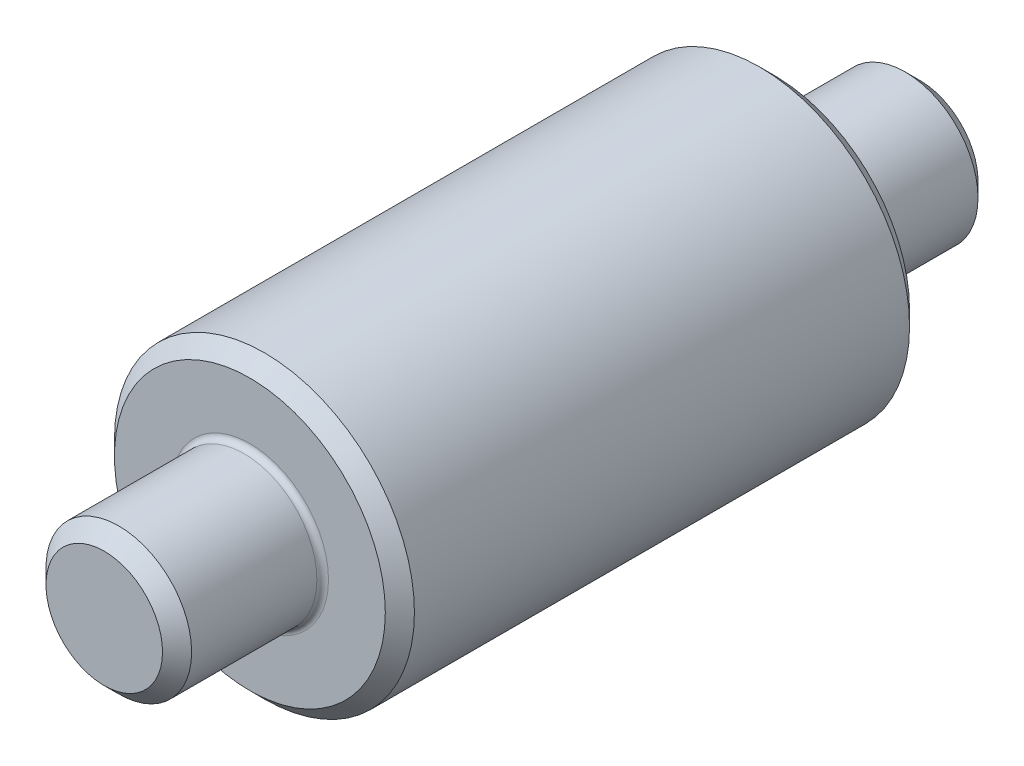
ISO-10303-21;
HEADER;
FILE_DESCRIPTION(('STEP AP214'),'2;1');
FILE_NAME('part.step','',(''),(''),'','','');
FILE_SCHEMA(('AUTOMOTIVE_DESIGN { 1 0 10303 214 1 1 1 1 }'));
ENDSEC;
DATA;
#1=APPLICATION_CONTEXT('core data for automotive mechanical design processes');
#2=APPLICATION_PROTOCOL_DEFINITION('international standard','automotive_design',2000,#1);
#3=PRODUCT_CONTEXT('',#1,'mechanical');
#4=PRODUCT('Part','Part','',(#3));
#5=PRODUCT_RELATED_PRODUCT_CATEGORY('part','',(#4));
#6=PRODUCT_DEFINITION_FORMATION('','',#4);
#7=PRODUCT_DEFINITION_CONTEXT('part definition',#1,'design');
#8=PRODUCT_DEFINITION('design','',#6,#7);
#9=PRODUCT_DEFINITION_SHAPE('','',#8);
#10=(LENGTH_UNIT() NAMED_UNIT(*) SI_UNIT(.MILLI.,.METRE.));
#11=(NAMED_UNIT(*) PLANE_ANGLE_UNIT() SI_UNIT($,.RADIAN.));
#12=(NAMED_UNIT(*) SI_UNIT($,.STERADIAN.) SOLID_ANGLE_UNIT());
#13=UNCERTAINTY_MEASURE_WITH_UNIT(LENGTH_MEASURE(1.E-05),#10,'distance_accuracy_value','');
#14=(GEOMETRIC_REPRESENTATION_CONTEXT(3) GLOBAL_UNCERTAINTY_ASSIGNED_CONTEXT((#13)) GLOBAL_UNIT_ASSIGNED_CONTEXT((#10,
#11,#12)) REPRESENTATION_CONTEXT('',''));
#15=CARTESIAN_POINT('',(0.,0.,0.));
#16=DIRECTION('',(0.,0.,1.));
#17=DIRECTION('',(1.,0.,0.));
#18=AXIS2_PLACEMENT_3D('',#15,#16,#17);
#19=CARTESIAN_POINT('',(0.,0.,-9.));
#20=DIRECTION('',(0.,0.,1.));
#21=DIRECTION('',(1.,0.,0.));
#22=AXIS2_PLACEMENT_3D('',#19,#20,#21);
#23=CYLINDRICAL_SURFACE('',#22,5.15);
#24=CARTESIAN_POINT('',(0.,0.,-8.5));
#25=DIRECTION('',(0.,0.,1.));
#26=DIRECTION('',(1.,0.,0.));
#27=AXIS2_PLACEMENT_3D('',#24,#25,#26);
#28=CIRCLE('',#27,5.15);
#29=CARTESIAN_POINT('',(5.15,0.,-8.5));
#30=VERTEX_POINT('',#29);
#31=EDGE_CURVE('E87',#30,#30,#28,.T.);
#32=ORIENTED_EDGE('',*,*,#31,.T.);
#33=EDGE_LOOP('',(#32));
#34=FACE_BOUND('',#33,.T.);
#35=CARTESIAN_POINT('',(0.,0.,8.5));
#36=DIRECTION('',(0.,0.,1.));
#37=DIRECTION('',(1.,0.,0.));
#38=AXIS2_PLACEMENT_3D('',#35,#36,#37);
#39=CIRCLE('',#38,5.15);
#40=CARTESIAN_POINT('',(5.15,0.,8.5));
#41=VERTEX_POINT('',#40);
#42=EDGE_CURVE('E91',#41,#41,#39,.F.);
#43=ORIENTED_EDGE('',*,*,#42,.T.);
#44=EDGE_LOOP('',(#43));
#45=FACE_BOUND('',#44,.T.);
#46=ADVANCED_FACE('F39',(#34,#45),#23,.T.);
#47=CARTESIAN_POINT('',(0.,0.,-9.));
#48=DIRECTION('',(0.,0.,1.));
#49=DIRECTION('',(1.,0.,0.));
#50=AXIS2_PLACEMENT_3D('',#47,#48,#49);
#51=PLANE('',#50);
#52=CARTESIAN_POINT('',(0.,0.,-9.));
#53=DIRECTION('',(0.,0.,1.));
#54=DIRECTION('',(1.,0.,0.));
#55=AXIS2_PLACEMENT_3D('',#52,#53,#54);
#56=CIRCLE('',#55,2.7);
#57=CARTESIAN_POINT('',(2.7,0.,-9.));
#58=VERTEX_POINT('',#57);
#59=EDGE_CURVE('E52',#58,#58,#56,.T.);
#60=ORIENTED_EDGE('',*,*,#59,.T.);
#61=EDGE_LOOP('',(#60));
#62=FACE_BOUND('',#61,.T.);
#63=CARTESIAN_POINT('',(0.,0.,-9.));
#64=DIRECTION('',(0.,0.,1.));
#65=DIRECTION('',(1.,0.,0.));
#66=AXIS2_PLACEMENT_3D('',#63,#64,#65);
#67=CIRCLE('',#66,4.65);
#68=CARTESIAN_POINT('',(4.65,0.,-9.));
#69=VERTEX_POINT('',#68);
#70=EDGE_CURVE('E83',#69,#69,#67,.F.);
#71=ORIENTED_EDGE('',*,*,#70,.T.);
#72=EDGE_LOOP('',(#71));
#73=FACE_BOUND('',#72,.T.);
#74=ADVANCED_FACE('F108',(#62,#73),#51,.F.);
#75=CARTESIAN_POINT('',(0.,0.,9.));
#76=DIRECTION('',(0.,0.,1.));
#77=DIRECTION('',(1.,0.,0.));
#78=AXIS2_PLACEMENT_3D('',#75,#76,#77);
#79=PLANE('',#78);
#80=CARTESIAN_POINT('',(0.,0.,9.));
#81=DIRECTION('',(0.,0.,1.));
#82=DIRECTION('',(1.,0.,0.));
#83=AXIS2_PLACEMENT_3D('',#80,#81,#82);
#84=CIRCLE('',#83,2.7);
#85=CARTESIAN_POINT('',(2.7,0.,9.));
#86=VERTEX_POINT('',#85);
#87=EDGE_CURVE('E10',#86,#86,#84,.F.);
#88=ORIENTED_EDGE('',*,*,#87,.T.);
#89=EDGE_LOOP('',(#88));
#90=FACE_BOUND('',#89,.T.);
#91=CARTESIAN_POINT('',(0.,0.,9.));
#92=DIRECTION('',(0.,0.,1.));
#93=DIRECTION('',(1.,0.,0.));
#94=AXIS2_PLACEMENT_3D('',#91,#92,#93);
#95=CIRCLE('',#94,4.65000000000001);
#96=CARTESIAN_POINT('',(4.65000000000001,0.,9.));
#97=VERTEX_POINT('',#96);
#98=EDGE_CURVE('E79',#97,#97,#95,.T.);
#99=ORIENTED_EDGE('',*,*,#98,.T.);
#100=EDGE_LOOP('',(#99));
#101=FACE_BOUND('',#100,.T.);
#102=ADVANCED_FACE('F105',(#90,#101),#79,.T.);
#103=CARTESIAN_POINT('',(0.,0.,14.));
#104=DIRECTION('',(0.,0.,-1.));
#105=DIRECTION('',(-1.,0.,0.));
#106=AXIS2_PLACEMENT_3D('',#103,#104,#105);
#107=CYLINDRICAL_SURFACE('',#106,2.5);
#108=CARTESIAN_POINT('',(0.,0.,9.2));
#109=DIRECTION('',(0.,0.,1.));
#110=DIRECTION('',(1.,0.,0.));
#111=AXIS2_PLACEMENT_3D('',#108,#109,#110);
#112=CIRCLE('',#111,2.5);
#113=CARTESIAN_POINT('',(2.5,0.,9.2));
#114=VERTEX_POINT('',#113);
#115=EDGE_CURVE('E47',#114,#114,#112,.T.);
#116=ORIENTED_EDGE('',*,*,#115,.T.);
#117=EDGE_LOOP('',(#116));
#118=FACE_BOUND('',#117,.T.);
#119=CARTESIAN_POINT('',(0.,0.,13.5));
#120=DIRECTION('',(0.,0.,1.));
#121=DIRECTION('',(1.,0.,0.));
#122=AXIS2_PLACEMENT_3D('',#119,#120,#121);
#123=CIRCLE('',#122,2.5);
#124=CARTESIAN_POINT('',(2.5,0.,13.5));
#125=VERTEX_POINT('',#124);
#126=EDGE_CURVE('E71',#125,#125,#123,.F.);
#127=ORIENTED_EDGE('',*,*,#126,.T.);
#128=EDGE_LOOP('',(#127));
#129=FACE_BOUND('',#128,.T.);
#130=ADVANCED_FACE('F107',(#118,#129),#107,.T.);
#131=CARTESIAN_POINT('',(0.,0.,14.));
#132=DIRECTION('',(0.,0.,1.));
#133=DIRECTION('',(1.,0.,0.));
#134=AXIS2_PLACEMENT_3D('',#131,#132,#133);
#135=PLANE('',#134);
#136=CARTESIAN_POINT('',(0.,0.,14.));
#137=DIRECTION('',(0.,0.,1.));
#138=DIRECTION('',(1.,0.,0.));
#139=AXIS2_PLACEMENT_3D('',#136,#137,#138);
#140=CIRCLE('',#139,2.);
#141=CARTESIAN_POINT('',(2.,0.,14.));
#142=VERTEX_POINT('',#141);
#143=EDGE_CURVE('E75',#142,#142,#140,.T.);
#144=ORIENTED_EDGE('',*,*,#143,.T.);
#145=EDGE_LOOP('',(#144));
#146=FACE_BOUND('',#145,.T.);
#147=ADVANCED_FACE('F114',(#146),#135,.T.);
#148=CARTESIAN_POINT('',(0.,0.,-14.));
#149=DIRECTION('',(0.,0.,1.));
#150=DIRECTION('',(1.,0.,0.));
#151=AXIS2_PLACEMENT_3D('',#148,#149,#150);
#152=CYLINDRICAL_SURFACE('',#151,2.5);
#153=CARTESIAN_POINT('',(0.,0.,-9.2));
#154=DIRECTION('',(0.,0.,1.));
#155=DIRECTION('',(1.,0.,0.));
#156=AXIS2_PLACEMENT_3D('',#153,#154,#155);
#157=CIRCLE('',#156,2.5);
#158=CARTESIAN_POINT('',(2.5,0.,-9.2));
#159=VERTEX_POINT('',#158);
#160=EDGE_CURVE('E57',#159,#159,#157,.F.);
#161=ORIENTED_EDGE('',*,*,#160,.T.);
#162=EDGE_LOOP('',(#161));
#163=FACE_BOUND('',#162,.T.);
#164=CARTESIAN_POINT('',(0.,0.,-13.5));
#165=DIRECTION('',(0.,0.,-1.));
#166=DIRECTION('',(-1.,0.,0.));
#167=AXIS2_PLACEMENT_3D('',#164,#165,#166);
#168=CIRCLE('',#167,2.5);
#169=CARTESIAN_POINT('',(-2.5,0.,-13.5));
#170=VERTEX_POINT('',#169);
#171=EDGE_CURVE('E63',#170,#170,#168,.F.);
#172=ORIENTED_EDGE('',*,*,#171,.T.);
#173=EDGE_LOOP('',(#172));
#174=FACE_BOUND('',#173,.T.);
#175=ADVANCED_FACE('F157',(#163,#174),#152,.T.);
#176=CARTESIAN_POINT('',(0.,0.,-14.));
#177=DIRECTION('',(0.,0.,-1.));
#178=DIRECTION('',(-1.,0.,0.));
#179=AXIS2_PLACEMENT_3D('',#176,#177,#178);
#180=PLANE('',#179);
#181=CARTESIAN_POINT('',(0.,0.,-14.));
#182=DIRECTION('',(0.,0.,-1.));
#183=DIRECTION('',(-1.,0.,0.));
#184=AXIS2_PLACEMENT_3D('',#181,#182,#183);
#185=CIRCLE('',#184,2.);
#186=CARTESIAN_POINT('',(-2.,0.,-14.));
#187=VERTEX_POINT('',#186);
#188=EDGE_CURVE('E67',#187,#187,#185,.T.);
#189=ORIENTED_EDGE('',*,*,#188,.T.);
#190=EDGE_LOOP('',(#189));
#191=FACE_BOUND('',#190,.T.);
#192=ADVANCED_FACE('F129',(#191),#180,.T.);
#193=CARTESIAN_POINT('',(0.,0.,-8.5));
#194=DIRECTION('',(0.,0.,1.));
#195=DIRECTION('',(1.,0.,0.));
#196=AXIS2_PLACEMENT_3D('',#193,#194,#195);
#197=CONICAL_SURFACE('',#196,5.15,0.785398163397453);
#198=ORIENTED_EDGE('',*,*,#70,.F.);
#199=EDGE_LOOP('',(#198));
#200=FACE_BOUND('',#199,.T.);
#201=ORIENTED_EDGE('',*,*,#31,.F.);
#202=EDGE_LOOP('',(#201));
#203=FACE_BOUND('',#202,.T.);
#204=ADVANCED_FACE('F101',(#200,#203),#197,.T.);
#205=CARTESIAN_POINT('',(0.,0.,9.));
#206=DIRECTION('',(0.,0.,-1.));
#207=DIRECTION('',(-1.,0.,0.));
#208=AXIS2_PLACEMENT_3D('',#205,#206,#207);
#209=CONICAL_SURFACE('',#208,4.65000000000001,0.785398163397444);
#210=ORIENTED_EDGE('',*,*,#42,.F.);
#211=EDGE_LOOP('',(#210));
#212=FACE_BOUND('',#211,.T.);
#213=ORIENTED_EDGE('',*,*,#98,.F.);
#214=EDGE_LOOP('',(#213));
#215=FACE_BOUND('',#214,.T.);
#216=ADVANCED_FACE('F97',(#212,#215),#209,.T.);
#217=CARTESIAN_POINT('',(0.,0.,14.));
#218=DIRECTION('',(0.,0.,-1.));
#219=DIRECTION('',(-1.,0.,0.));
#220=AXIS2_PLACEMENT_3D('',#217,#218,#219);
#221=CONICAL_SURFACE('',#220,2.,0.785398163397446);
#222=ORIENTED_EDGE('',*,*,#126,.F.);
#223=EDGE_LOOP('',(#222));
#224=FACE_BOUND('',#223,.T.);
#225=ORIENTED_EDGE('',*,*,#143,.F.);
#226=EDGE_LOOP('',(#225));
#227=FACE_BOUND('',#226,.T.);
#228=ADVANCED_FACE('F100',(#224,#227),#221,.T.);
#229=CARTESIAN_POINT('',(0.,0.,-14.));
#230=DIRECTION('',(0.,0.,1.));
#231=DIRECTION('',(1.,0.,0.));
#232=AXIS2_PLACEMENT_3D('',#229,#230,#231);
#233=CONICAL_SURFACE('',#232,2.,0.785398163397446);
#234=ORIENTED_EDGE('',*,*,#171,.F.);
#235=EDGE_LOOP('',(#234));
#236=FACE_BOUND('',#235,.T.);
#237=ORIENTED_EDGE('',*,*,#188,.F.);
#238=EDGE_LOOP('',(#237));
#239=FACE_BOUND('',#238,.T.);
#240=ADVANCED_FACE('F140',(#236,#239),#233,.T.);
#241=CARTESIAN_POINT('',(0.,0.,-9.2));
#242=DIRECTION('',(0.,0.,1.));
#243=DIRECTION('',(1.,0.,0.));
#244=AXIS2_PLACEMENT_3D('',#241,#242,#243);
#245=TOROIDAL_SURFACE('',#244,2.7,0.2);
#246=ORIENTED_EDGE('',*,*,#59,.F.);
#247=EDGE_LOOP('',(#246));
#248=FACE_BOUND('',#247,.T.);
#249=ORIENTED_EDGE('',*,*,#160,.F.);
#250=EDGE_LOOP('',(#249));
#251=FACE_BOUND('',#250,.T.);
#252=ADVANCED_FACE('F145',(#248,#251),#245,.F.);
#253=CARTESIAN_POINT('',(0.,0.,9.2));
#254=DIRECTION('',(0.,0.,1.));
#255=DIRECTION('',(1.,0.,0.));
#256=AXIS2_PLACEMENT_3D('',#253,#254,#255);
#257=TOROIDAL_SURFACE('',#256,2.7,0.2);
#258=ORIENTED_EDGE('',*,*,#87,.F.);
#259=EDGE_LOOP('',(#258));
#260=FACE_BOUND('',#259,.T.);
#261=ORIENTED_EDGE('',*,*,#115,.F.);
#262=EDGE_LOOP('',(#261));
#263=FACE_BOUND('',#262,.T.);
#264=ADVANCED_FACE('F41',(#260,#263),#257,.F.);
#265=CLOSED_SHELL('',(#46,#74,#102,#130,#147,#175,#192,#204,#216,#228,#240,#252,#264));
#266=MANIFOLD_SOLID_BREP('B2',#265);
#267=ADVANCED_BREP_SHAPE_REPRESENTATION('',(#18,#266),#14);
#268=SHAPE_DEFINITION_REPRESENTATION(#9,#267);
ENDSEC;
END-ISO-10303-21;
